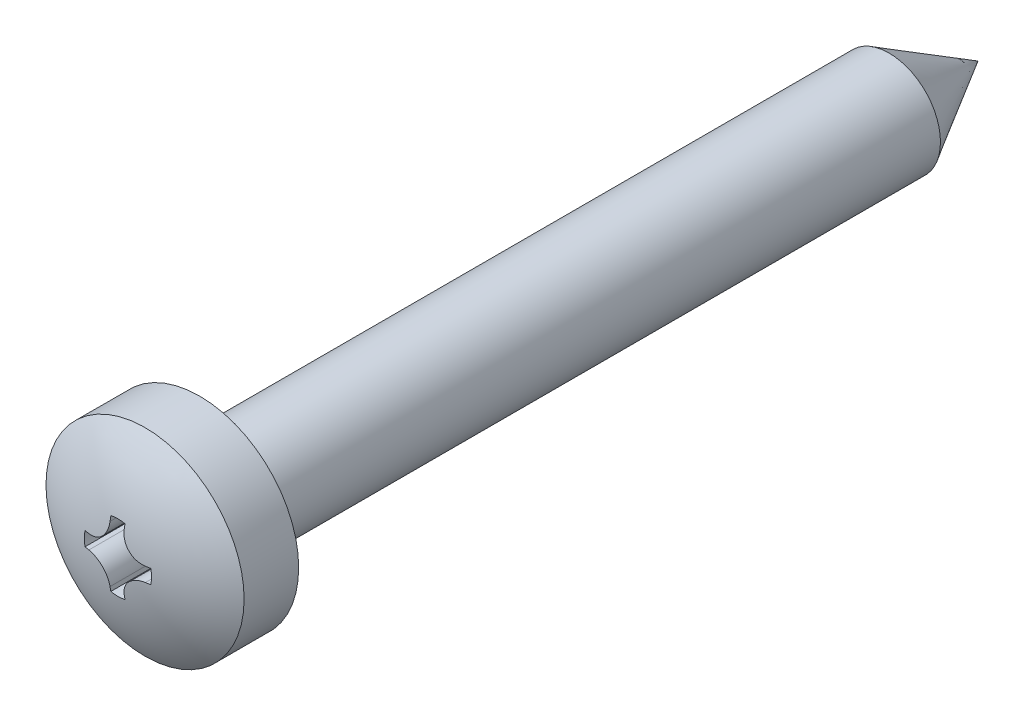
ISO-10303-21;
HEADER;
FILE_DESCRIPTION(('STEP AP214'),'2;1');
FILE_NAME('part.step','',(''),(''),'','','');
FILE_SCHEMA(('AUTOMOTIVE_DESIGN { 1 0 10303 214 1 1 1 1 }'));
ENDSEC;
DATA;
#1=APPLICATION_CONTEXT('core data for automotive mechanical design processes');
#2=APPLICATION_PROTOCOL_DEFINITION('international standard','automotive_design',2000,#1);
#3=PRODUCT_CONTEXT('',#1,'mechanical');
#4=PRODUCT('Part','Part','',(#3));
#5=PRODUCT_RELATED_PRODUCT_CATEGORY('part','',(#4));
#6=PRODUCT_DEFINITION_FORMATION('','',#4);
#7=PRODUCT_DEFINITION_CONTEXT('part definition',#1,'design');
#8=PRODUCT_DEFINITION('design','',#6,#7);
#9=PRODUCT_DEFINITION_SHAPE('','',#8);
#10=(LENGTH_UNIT() NAMED_UNIT(*) SI_UNIT(.MILLI.,.METRE.));
#11=(NAMED_UNIT(*) PLANE_ANGLE_UNIT() SI_UNIT($,.RADIAN.));
#12=(NAMED_UNIT(*) SI_UNIT($,.STERADIAN.) SOLID_ANGLE_UNIT());
#13=UNCERTAINTY_MEASURE_WITH_UNIT(LENGTH_MEASURE(1.E-05),#10,'distance_accuracy_value','');
#14=(GEOMETRIC_REPRESENTATION_CONTEXT(3) GLOBAL_UNCERTAINTY_ASSIGNED_CONTEXT((#13)) GLOBAL_UNIT_ASSIGNED_CONTEXT((#10,
#11,#12)) REPRESENTATION_CONTEXT('',''));
#15=CARTESIAN_POINT('',(0.,0.,0.));
#16=DIRECTION('',(0.,0.,1.));
#17=DIRECTION('',(1.,0.,0.));
#18=AXIS2_PLACEMENT_3D('',#15,#16,#17);
#19=CARTESIAN_POINT('',(0.,0.,19.4));
#20=DIRECTION('',(0.,0.,1.));
#21=DIRECTION('',(0.,1.,0.));
#22=AXIS2_PLACEMENT_3D('',#19,#20,#21);
#23=SPHERICAL_SURFACE('',#22,5.);
#24=CARTESIAN_POINT('',(0.,0.,23.5424630354416));
#25=DIRECTION('',(0.,0.,1.));
#26=DIRECTION('',(1.,0.,0.));
#27=AXIS2_PLACEMENT_3D('',#24,#25,#26);
#28=CIRCLE('',#27,2.8);
#29=CARTESIAN_POINT('',(2.8,0.,23.5424630354416));
#30=VERTEX_POINT('',#29);
#31=EDGE_CURVE('E189',#30,#30,#28,.T.);
#32=ORIENTED_EDGE('',*,*,#31,.T.);
#33=EDGE_LOOP('',(#32));
#34=FACE_BOUND('',#33,.T.);
#35=CARTESIAN_POINT('',(0.,0.,24.3089204515861));
#36=DIRECTION('',(0.,0.,-1.));
#37=DIRECTION('',(-1.,0.,0.));
#38=AXIS2_PLACEMENT_3D('',#35,#36,#37);
#39=CIRCLE('',#38,0.95);
#40=CARTESIAN_POINT('',(0.199999999999999,0.928708781050336,24.3089204515861));
#41=VERTEX_POINT('',#40);
#42=CARTESIAN_POINT('',(-0.199999999999997,0.928708781050336,24.3089204515861));
#43=VERTEX_POINT('',#42);
#44=EDGE_CURVE('E293',#41,#43,#39,.F.);
#45=ORIENTED_EDGE('',*,*,#44,.F.);
#46=CARTESIAN_POINT('',(0.200000000000013,0.,19.4));
#47=DIRECTION('',(-1.,0.,0.));
#48=DIRECTION('',(0.,-1.,0.));
#49=AXIS2_PLACEMENT_3D('',#46,#47,#48);
#50=CIRCLE('',#49,4.99599839871872);
#51=CARTESIAN_POINT('',(0.200000000000001,0.797500009462237,24.3319361040982));
#52=VERTEX_POINT('',#51);
#53=EDGE_CURVE('E175',#52,#41,#50,.T.);
#54=ORIENTED_EDGE('',*,*,#53,.F.);
#55=CARTESIAN_POINT('',(0.200000033472805,0.797700009462236,24.3319037583386));
#56=CARTESIAN_POINT('',(0.199959253117828,0.764708817685606,24.3372450026347));
#57=CARTESIAN_POINT('',(0.202709128813232,0.731640466129004,24.3421389681577));
#58=CARTESIAN_POINT('',(0.213653637195818,0.666282732986848,24.3509117634436));
#59=CARTESIAN_POINT('',(0.221847801353419,0.633993284617508,24.3547906805205));
#60=CARTESIAN_POINT('',(0.243555568778322,0.571088201610531,24.3614171793675));
#61=CARTESIAN_POINT('',(0.257074653927373,0.540474329048727,24.364163589265));
#62=CARTESIAN_POINT('',(0.289068737352572,0.481878485435129,24.3684353734394));
#63=CARTESIAN_POINT('',(0.30754153494713,0.453895353117194,24.3699612887238));
#64=CARTESIAN_POINT('',(0.348646595686665,0.401741777280698,24.371733860277));
#65=CARTESIAN_POINT('',(0.371219136327946,0.377524829205055,24.3719975623989));
#66=CARTESIAN_POINT('',(0.42004221247523,0.33315104363588,24.3712838517845));
#67=CARTESIAN_POINT('',(0.446293163672993,0.31299466564983,24.3703062986749));
#68=CARTESIAN_POINT('',(0.501529122246131,0.277422821121843,24.3671501235125));
#69=CARTESIAN_POINT('',(0.530496065410743,0.261978583187333,24.3649790268822));
#70=CARTESIAN_POINT('',(0.590474078177402,0.236061672214504,24.3595049326867));
#71=CARTESIAN_POINT('',(0.621484749229964,0.225588033102557,24.3562021552872));
#72=CARTESIAN_POINT('',(0.67678218077813,0.211811110107704,24.349515949383));
#73=CARTESIAN_POINT('',(0.700820773823943,0.207371844731834,24.3463573247891));
#74=CARTESIAN_POINT('',(0.749150929493058,0.201461310152338,24.3395132745871));
#75=CARTESIAN_POINT('',(0.773442081704409,0.199985810303452,24.3358286079455));
#76=CARTESIAN_POINT('',(0.797700009462237,0.200000033472804,24.3319037583386));
#77=B_SPLINE_CURVE_WITH_KNOTS('',3,(#55,#56,#57,#58,#59,#60,#61,#62,#63,#64,#65,#66,#67,#68,#69,
#70,#71,#72,#73,#74,#75,#76),.UNSPECIFIED.,.F.,.F.,(4,2,2,2,2,2,2,2,2,2,4),(0.,
0.100151318053274,0.200294018308518,0.30054008372607,0.400741688499828,0.499586204595047,
0.598441899985654,0.696681331546745,0.794901661700852,0.86866818761134,0.94232933999777),.UNSPECIFIED.);
#78=CARTESIAN_POINT('',(0.797500009462238,0.2,24.3319361040982));
#79=VERTEX_POINT('',#78);
#80=EDGE_CURVE('E284',#52,#79,#77,.T.);
#81=ORIENTED_EDGE('',*,*,#80,.T.);
#82=CARTESIAN_POINT('',(0.,0.200000000000013,19.4));
#83=DIRECTION('',(0.,1.,0.));
#84=DIRECTION('',(-1.,0.,0.));
#85=AXIS2_PLACEMENT_3D('',#82,#83,#84);
#86=CIRCLE('',#85,4.99599839871872);
#87=CARTESIAN_POINT('',(0.928708781050337,0.199999999999998,24.3089204515861));
#88=VERTEX_POINT('',#87);
#89=EDGE_CURVE('E291',#79,#88,#86,.T.);
#90=ORIENTED_EDGE('',*,*,#89,.T.);
#91=CARTESIAN_POINT('',(0.,0.,24.3089204515861));
#92=DIRECTION('',(0.,0.,-1.));
#93=DIRECTION('',(-1.,0.,0.));
#94=AXIS2_PLACEMENT_3D('',#91,#92,#93);
#95=CIRCLE('',#94,0.950000000000001);
#96=CARTESIAN_POINT('',(0.928708781050337,-0.199999999999996,24.3089204515861));
#97=VERTEX_POINT('',#96);
#98=EDGE_CURVE('E366',#88,#97,#95,.T.);
#99=ORIENTED_EDGE('',*,*,#98,.T.);
#100=CARTESIAN_POINT('',(0.,-0.200000000000022,19.4));
#101=DIRECTION('',(0.,1.,0.));
#102=DIRECTION('',(-1.,0.,0.));
#103=AXIS2_PLACEMENT_3D('',#100,#101,#102);
#104=CIRCLE('',#103,4.99599839871872);
#105=CARTESIAN_POINT('',(0.797500009462238,-0.2,24.3319361040982));
#106=VERTEX_POINT('',#105);
#107=EDGE_CURVE('E256',#106,#97,#104,.T.);
#108=ORIENTED_EDGE('',*,*,#107,.F.);
#109=CARTESIAN_POINT('',(0.200000033472805,-0.797700009462236,24.3319037583386));
#110=CARTESIAN_POINT('',(0.199959253117828,-0.764708817685606,24.3372450026347));
#111=CARTESIAN_POINT('',(0.202709128813232,-0.731640466129004,24.3421389681577));
#112=CARTESIAN_POINT('',(0.213653637195818,-0.666282732986848,24.3509117634436));
#113=CARTESIAN_POINT('',(0.221847801353418,-0.633993284617508,24.3547906805205));
#114=CARTESIAN_POINT('',(0.243555568778322,-0.571088201610532,24.3614171793675));
#115=CARTESIAN_POINT('',(0.257074653927373,-0.540474329048727,24.364163589265));
#116=CARTESIAN_POINT('',(0.289068737352572,-0.48187848543513,24.3684353734394));
#117=CARTESIAN_POINT('',(0.307541534947129,-0.453895353117195,24.3699612887238));
#118=CARTESIAN_POINT('',(0.348646595686665,-0.401741777280698,24.371733860277));
#119=CARTESIAN_POINT('',(0.371219136327946,-0.377524829205055,24.3719975623989));
#120=CARTESIAN_POINT('',(0.42004221247523,-0.33315104363588,24.3712838517845));
#121=CARTESIAN_POINT('',(0.446293163672993,-0.312994665649831,24.3703062986749));
#122=CARTESIAN_POINT('',(0.501529122246131,-0.277422821121843,24.3671501235125));
#123=CARTESIAN_POINT('',(0.530496065410742,-0.261978583187333,24.3649790268822));
#124=CARTESIAN_POINT('',(0.590474078177402,-0.236061672214504,24.3595049326867));
#125=CARTESIAN_POINT('',(0.621484749229964,-0.225588033102557,24.3562021552872));
#126=CARTESIAN_POINT('',(0.67678218077813,-0.211811110107704,24.349515949383));
#127=CARTESIAN_POINT('',(0.700820773823943,-0.207371844731834,24.3463573247891));
#128=CARTESIAN_POINT('',(0.749150929493058,-0.201461310152338,24.3395132745871));
#129=CARTESIAN_POINT('',(0.773442081704408,-0.199985810303452,24.3358286079455));
#130=CARTESIAN_POINT('',(0.797700009462237,-0.200000033472804,24.3319037583386));
#131=B_SPLINE_CURVE_WITH_KNOTS('',3,(#109,#110,#111,#112,#113,#114,#115,#116,#117,#118,#119,
#120,#121,#122,#123,#124,#125,#126,#127,#128,#129,#130),.UNSPECIFIED.,.F.,.F.,(4,2,2,2,2,2,2,2,
2,2,4),(0.,0.100151318053274,0.200294018308518,0.300540083726069,0.400741688499827,
0.499586204595047,0.598441899985654,0.696681331546744,0.794901661700852,0.86866818761134,
0.94232933999777),.UNSPECIFIED.);
#132=CARTESIAN_POINT('',(0.200000000000001,-0.797500009462237,24.3319361040982));
#133=VERTEX_POINT('',#132);
#134=EDGE_CURVE('E250',#133,#106,#131,.T.);
#135=ORIENTED_EDGE('',*,*,#134,.F.);
#136=CARTESIAN_POINT('',(0.20000000000001,0.,19.4));
#137=DIRECTION('',(1.,0.,0.));
#138=DIRECTION('',(0.,1.,0.));
#139=AXIS2_PLACEMENT_3D('',#136,#137,#138);
#140=CIRCLE('',#139,4.99599839871872);
#141=CARTESIAN_POINT('',(0.199999999999999,-0.928708781050336,24.3089204515861));
#142=VERTEX_POINT('',#141);
#143=EDGE_CURVE('E247',#133,#142,#140,.T.);
#144=ORIENTED_EDGE('',*,*,#143,.T.);
#145=CARTESIAN_POINT('',(0.,0.,24.3089204515861));
#146=DIRECTION('',(0.,0.,-1.));
#147=DIRECTION('',(-1.,0.,0.));
#148=AXIS2_PLACEMENT_3D('',#145,#146,#147);
#149=CIRCLE('',#148,0.95);
#150=CARTESIAN_POINT('',(-0.199999999999997,-0.928708781050336,24.3089204515861));
#151=VERTEX_POINT('',#150);
#152=EDGE_CURVE('E244',#142,#151,#149,.T.);
#153=ORIENTED_EDGE('',*,*,#152,.T.);
#154=CARTESIAN_POINT('',(-0.200000000000015,0.,19.4));
#155=DIRECTION('',(1.,0.,0.));
#156=DIRECTION('',(0.,1.,0.));
#157=AXIS2_PLACEMENT_3D('',#154,#155,#156);
#158=CIRCLE('',#157,4.99599839871872);
#159=CARTESIAN_POINT('',(-0.2,-0.797500009462236,24.3319361040982));
#160=VERTEX_POINT('',#159);
#161=EDGE_CURVE('E241',#160,#151,#158,.T.);
#162=ORIENTED_EDGE('',*,*,#161,.F.);
#163=CARTESIAN_POINT('',(-0.200000033472803,-0.797700009462235,24.3319037583386));
#164=CARTESIAN_POINT('',(-0.199959253117827,-0.764708817685605,24.3372450026347));
#165=CARTESIAN_POINT('',(-0.20270912881323,-0.731640466129003,24.3421389681577));
#166=CARTESIAN_POINT('',(-0.213653637195817,-0.666282732986848,24.3509117634436));
#167=CARTESIAN_POINT('',(-0.221847801353417,-0.633993284617507,24.3547906805205));
#168=CARTESIAN_POINT('',(-0.24355556877832,-0.57108820161053,24.3614171793675));
#169=CARTESIAN_POINT('',(-0.257074653927372,-0.540474329048726,24.364163589265));
#170=CARTESIAN_POINT('',(-0.28906873735257,-0.481878485435128,24.3684353734394));
#171=CARTESIAN_POINT('',(-0.307541534947128,-0.453895353117193,24.3699612887238));
#172=CARTESIAN_POINT('',(-0.348646595686664,-0.401741777280697,24.371733860277));
#173=CARTESIAN_POINT('',(-0.371219136327945,-0.377524829205054,24.3719975623989));
#174=CARTESIAN_POINT('',(-0.420042212475229,-0.333151043635879,24.3712838517845));
#175=CARTESIAN_POINT('',(-0.446293163672991,-0.31299466564983,24.3703062986749));
#176=CARTESIAN_POINT('',(-0.501529122246129,-0.277422821121843,24.3671501235125));
#177=CARTESIAN_POINT('',(-0.530496065410741,-0.261978583187332,24.3649790268822));
#178=CARTESIAN_POINT('',(-0.5904740781774,-0.236061672214503,24.3595049326867));
#179=CARTESIAN_POINT('',(-0.621484749229962,-0.225588033102557,24.3562021552872));
#180=CARTESIAN_POINT('',(-0.676782180778129,-0.211811110107704,24.349515949383));
#181=CARTESIAN_POINT('',(-0.700820773823942,-0.207371844731833,24.3463573247891));
#182=CARTESIAN_POINT('',(-0.749150929493057,-0.201461310152337,24.3395132745871));
#183=CARTESIAN_POINT('',(-0.773442081704407,-0.199985810303451,24.3358286079455));
#184=CARTESIAN_POINT('',(-0.797700009462235,-0.200000033472803,24.3319037583386));
#185=B_SPLINE_CURVE_WITH_KNOTS('',3,(#163,#164,#165,#166,#167,#168,#169,#170,#171,#172,#173,
#174,#175,#176,#177,#178,#179,#180,#181,#182,#183,#184),.UNSPECIFIED.,.F.,.F.,(4,2,2,2,2,2,2,2,
2,2,4),(0.,0.100151318053273,0.200294018308518,0.30054008372607,0.400741688499828,
0.499586204595047,0.598441899985654,0.696681331546744,0.794901661700851,0.86866818761134,
0.942329339997769),.UNSPECIFIED.);
#186=CARTESIAN_POINT('',(-0.797500009462236,-0.199999999999999,24.3319361040982));
#187=VERTEX_POINT('',#186);
#188=EDGE_CURVE('E234',#160,#187,#185,.T.);
#189=ORIENTED_EDGE('',*,*,#188,.T.);
#190=CARTESIAN_POINT('',(0.,-0.200000000000015,19.4));
#191=DIRECTION('',(0.,-1.,0.));
#192=DIRECTION('',(1.,0.,0.));
#193=AXIS2_PLACEMENT_3D('',#190,#191,#192);
#194=CIRCLE('',#193,4.99599839871872);
#195=CARTESIAN_POINT('',(-0.928708781050336,-0.199999999999997,24.3089204515861));
#196=VERTEX_POINT('',#195);
#197=EDGE_CURVE('E242',#187,#196,#194,.T.);
#198=ORIENTED_EDGE('',*,*,#197,.T.);
#199=CARTESIAN_POINT('',(0.,0.,24.3089204515861));
#200=DIRECTION('',(0.,0.,-1.));
#201=DIRECTION('',(-1.,0.,0.));
#202=AXIS2_PLACEMENT_3D('',#199,#200,#201);
#203=CIRCLE('',#202,0.95);
#204=CARTESIAN_POINT('',(-0.928708781050336,0.199999999999997,24.3089204515861));
#205=VERTEX_POINT('',#204);
#206=EDGE_CURVE('E405',#205,#196,#203,.F.);
#207=ORIENTED_EDGE('',*,*,#206,.F.);
#208=CARTESIAN_POINT('',(0.,0.200000000000015,19.4));
#209=DIRECTION('',(0.,-1.,0.));
#210=DIRECTION('',(1.,0.,0.));
#211=AXIS2_PLACEMENT_3D('',#208,#209,#210);
#212=CIRCLE('',#211,4.99599839871872);
#213=CARTESIAN_POINT('',(-0.797500009462236,0.199999999999999,24.3319361040982));
#214=VERTEX_POINT('',#213);
#215=EDGE_CURVE('E202',#214,#205,#212,.T.);
#216=ORIENTED_EDGE('',*,*,#215,.F.);
#217=CARTESIAN_POINT('',(-0.200000033472804,0.797700009462235,24.3319037583386));
#218=CARTESIAN_POINT('',(-0.199959253117827,0.764708817685605,24.3372450026347));
#219=CARTESIAN_POINT('',(-0.20270912881323,0.731640466129002,24.3421389681577));
#220=CARTESIAN_POINT('',(-0.213653637195817,0.666282732986847,24.3509117634436));
#221=CARTESIAN_POINT('',(-0.221847801353417,0.633993284617507,24.3547906805205));
#222=CARTESIAN_POINT('',(-0.24355556877832,0.57108820161053,24.3614171793675));
#223=CARTESIAN_POINT('',(-0.257074653927372,0.540474329048726,24.364163589265));
#224=CARTESIAN_POINT('',(-0.28906873735257,0.481878485435129,24.3684353734394));
#225=CARTESIAN_POINT('',(-0.307541534947128,0.453895353117193,24.3699612887238));
#226=CARTESIAN_POINT('',(-0.348646595686664,0.401741777280697,24.371733860277));
#227=CARTESIAN_POINT('',(-0.371219136327945,0.377524829205054,24.3719975623989));
#228=CARTESIAN_POINT('',(-0.420042212475229,0.333151043635879,24.3712838517845));
#229=CARTESIAN_POINT('',(-0.446293163672992,0.31299466564983,24.3703062986749));
#230=CARTESIAN_POINT('',(-0.501529122246129,0.277422821121842,24.3671501235125));
#231=CARTESIAN_POINT('',(-0.530496065410741,0.261978583187332,24.3649790268822));
#232=CARTESIAN_POINT('',(-0.590474078177401,0.236061672214503,24.3595049326867));
#233=CARTESIAN_POINT('',(-0.621484749229963,0.225588033102556,24.3562021552872));
#234=CARTESIAN_POINT('',(-0.676782180778129,0.211811110107703,24.349515949383));
#235=CARTESIAN_POINT('',(-0.700820773823943,0.207371844731833,24.3463573247891));
#236=CARTESIAN_POINT('',(-0.749150929493057,0.201461310152337,24.3395132745871));
#237=CARTESIAN_POINT('',(-0.773442081704407,0.199985810303451,24.3358286079455));
#238=CARTESIAN_POINT('',(-0.797700009462235,0.200000033472803,24.3319037583386));
#239=B_SPLINE_CURVE_WITH_KNOTS('',3,(#217,#218,#219,#220,#221,#222,#223,#224,#225,#226,#227,
#228,#229,#230,#231,#232,#233,#234,#235,#236,#237,#238),.UNSPECIFIED.,.F.,.F.,(4,2,2,2,2,2,2,2,
2,2,4),(0.,0.100151318053274,0.200294018308518,0.30054008372607,0.400741688499827,
0.499586204595047,0.598441899985654,0.696681331546744,0.794901661700852,0.868668187611341,
0.942329339997769),.UNSPECIFIED.);
#240=CARTESIAN_POINT('',(-0.2,0.797500009462236,24.3319361040982));
#241=VERTEX_POINT('',#240);
#242=EDGE_CURVE('E195',#241,#214,#239,.T.);
#243=ORIENTED_EDGE('',*,*,#242,.F.);
#244=CARTESIAN_POINT('',(-0.200000000000015,0.,19.4));
#245=DIRECTION('',(-1.,0.,0.));
#246=DIRECTION('',(0.,-1.,0.));
#247=AXIS2_PLACEMENT_3D('',#244,#245,#246);
#248=CIRCLE('',#247,4.99599839871872);
#249=EDGE_CURVE('E192',#241,#43,#248,.T.);
#250=ORIENTED_EDGE('',*,*,#249,.T.);
#251=EDGE_LOOP('',(#45,#54,#81,#90,#99,#108,#135,#144,#153,#162,#189,#198,#207,#216,#243,#250));
#252=FACE_BOUND('',#251,.T.);
#253=ADVANCED_FACE('F40',(#34,#252),#23,.T.);
#254=CARTESIAN_POINT('',(0.,0.,0.));
#255=DIRECTION('',(0.,0.,1.));
#256=DIRECTION('',(1.,0.,0.));
#257=AXIS2_PLACEMENT_3D('',#254,#255,#256);
#258=CONICAL_SURFACE('',#257,0.,0.523598775598292);
#259=CARTESIAN_POINT('',(0.,0.,2.51147367097491));
#260=DIRECTION('',(0.,0.,1.));
#261=DIRECTION('',(1.,0.,0.));
#262=AXIS2_PLACEMENT_3D('',#259,#260,#261);
#263=CIRCLE('',#262,1.45);
#264=CARTESIAN_POINT('',(1.45,0.,2.51147367097491));
#265=VERTEX_POINT('',#264);
#266=EDGE_CURVE('E176',#265,#265,#263,.T.);
#267=ORIENTED_EDGE('',*,*,#266,.F.);
#268=EDGE_LOOP('',(#267));
#269=FACE_BOUND('',#268,.T.);
#270=CARTESIAN_POINT('',(0.,0.,0.));
#271=VERTEX_POINT('',#270);
#272=VERTEX_LOOP('',#271);
#273=FACE_BOUND('',#272,.T.);
#274=ADVANCED_FACE('F307',(#269,#273),#258,.T.);
#275=CARTESIAN_POINT('',(0.,0.,11.71));
#276=DIRECTION('',(0.,0.,1.));
#277=DIRECTION('',(1.,0.,0.));
#278=AXIS2_PLACEMENT_3D('',#275,#276,#277);
#279=CYLINDRICAL_SURFACE('',#278,2.8);
#280=ORIENTED_EDGE('',*,*,#31,.F.);
#281=EDGE_LOOP('',(#280));
#282=FACE_BOUND('',#281,.T.);
#283=CARTESIAN_POINT('',(0.,0.,22.));
#284=DIRECTION('',(0.,0.,1.));
#285=DIRECTION('',(1.,0.,0.));
#286=AXIS2_PLACEMENT_3D('',#283,#284,#285);
#287=CIRCLE('',#286,2.8);
#288=CARTESIAN_POINT('',(2.8,0.,22.));
#289=VERTEX_POINT('',#288);
#290=EDGE_CURVE('E180',#289,#289,#287,.T.);
#291=ORIENTED_EDGE('',*,*,#290,.T.);
#292=EDGE_LOOP('',(#291));
#293=FACE_BOUND('',#292,.T.);
#294=ADVANCED_FACE('F312',(#282,#293),#279,.T.);
#295=CARTESIAN_POINT('',(0.,2.8,22.));
#296=DIRECTION('',(0.,0.,1.));
#297=DIRECTION('',(1.,0.,0.));
#298=AXIS2_PLACEMENT_3D('',#295,#296,#297);
#299=PLANE('',#298);
#300=CARTESIAN_POINT('',(0.,0.,22.));
#301=DIRECTION('',(0.,0.,1.));
#302=DIRECTION('',(1.,0.,0.));
#303=AXIS2_PLACEMENT_3D('',#300,#301,#302);
#304=CIRCLE('',#303,1.55);
#305=CARTESIAN_POINT('',(1.55,0.,22.));
#306=VERTEX_POINT('',#305);
#307=EDGE_CURVE('E49',#306,#306,#304,.T.);
#308=ORIENTED_EDGE('',*,*,#307,.T.);
#309=EDGE_LOOP('',(#308));
#310=FACE_BOUND('',#309,.T.);
#311=ORIENTED_EDGE('',*,*,#290,.F.);
#312=EDGE_LOOP('',(#311));
#313=FACE_BOUND('',#312,.T.);
#314=ADVANCED_FACE('F297',(#310,#313),#299,.F.);
#315=CARTESIAN_POINT('',(0.,0.,11.71));
#316=DIRECTION('',(0.,0.,1.));
#317=DIRECTION('',(1.,0.,0.));
#318=AXIS2_PLACEMENT_3D('',#315,#316,#317);
#319=CYLINDRICAL_SURFACE('',#318,1.45);
#320=CARTESIAN_POINT('',(0.,0.,21.9));
#321=DIRECTION('',(0.,0.,1.));
#322=DIRECTION('',(1.,0.,0.));
#323=AXIS2_PLACEMENT_3D('',#320,#321,#322);
#324=CIRCLE('',#323,1.45);
#325=CARTESIAN_POINT('',(1.45,0.,21.9));
#326=VERTEX_POINT('',#325);
#327=EDGE_CURVE('E11',#326,#326,#324,.F.);
#328=ORIENTED_EDGE('',*,*,#327,.T.);
#329=EDGE_LOOP('',(#328));
#330=FACE_BOUND('',#329,.T.);
#331=ORIENTED_EDGE('',*,*,#266,.T.);
#332=EDGE_LOOP('',(#331));
#333=FACE_BOUND('',#332,.T.);
#334=ADVANCED_FACE('F459',(#330,#333),#319,.T.);
#335=CARTESIAN_POINT('',(0.,0.,23.2));
#336=DIRECTION('',(0.,0.,1.));
#337=DIRECTION('',(1.,0.,0.));
#338=AXIS2_PLACEMENT_3D('',#335,#336,#337);
#339=CYLINDRICAL_SURFACE('',#338,0.95);
#340=ORIENTED_EDGE('',*,*,#44,.T.);
#341=DIRECTION('',(0.,0.,1.));
#342=VECTOR('',#341,1.);
#343=CARTESIAN_POINT('',(-0.199999999999997,0.928708781050336,23.2));
#344=LINE('',#343,#342);
#345=CARTESIAN_POINT('',(-0.199999999999997,0.928708781050336,23.2));
#346=VERTEX_POINT('',#345);
#347=EDGE_CURVE('E56',#346,#43,#344,.T.);
#348=ORIENTED_EDGE('',*,*,#347,.F.);
#349=CARTESIAN_POINT('',(0.,0.,23.2));
#350=DIRECTION('',(0.,0.,-1.));
#351=DIRECTION('',(-1.,0.,0.));
#352=AXIS2_PLACEMENT_3D('',#349,#350,#351);
#353=CIRCLE('',#352,0.95);
#354=CARTESIAN_POINT('',(0.199999999999999,0.928708781050336,23.2));
#355=VERTEX_POINT('',#354);
#356=EDGE_CURVE('E158',#346,#355,#353,.T.);
#357=ORIENTED_EDGE('',*,*,#356,.T.);
#358=DIRECTION('',(0.,0.,1.));
#359=VECTOR('',#358,1.);
#360=CARTESIAN_POINT('',(0.199999999999999,0.928708781050336,23.2));
#361=LINE('',#360,#359);
#362=EDGE_CURVE('E170',#355,#41,#361,.T.);
#363=ORIENTED_EDGE('',*,*,#362,.T.);
#364=EDGE_LOOP('',(#340,#348,#357,#363));
#365=FACE_BOUND('',#364,.T.);
#366=ADVANCED_FACE('F169',(#365),#339,.F.);
#367=CARTESIAN_POINT('',(0.199999999999999,0.928708781050336,23.2));
#368=DIRECTION('',(-1.,0.,0.));
#369=DIRECTION('',(0.,-1.,0.));
#370=AXIS2_PLACEMENT_3D('',#367,#368,#369);
#371=PLANE('',#370);
#372=ORIENTED_EDGE('',*,*,#53,.T.);
#373=ORIENTED_EDGE('',*,*,#362,.F.);
#374=DIRECTION('',(0.,-1.,0.));
#375=VECTOR('',#374,1.);
#376=CARTESIAN_POINT('',(0.199999999999999,0.928708781050336,23.2));
#377=LINE('',#376,#375);
#378=CARTESIAN_POINT('',(0.200000000000001,0.797500009462237,23.2));
#379=VERTEX_POINT('',#378);
#380=EDGE_CURVE('E154',#355,#379,#377,.T.);
#381=ORIENTED_EDGE('',*,*,#380,.T.);
#382=DIRECTION('',(0.,0.,1.));
#383=VECTOR('',#382,1.);
#384=CARTESIAN_POINT('',(0.200000000000001,0.797500009462237,23.2));
#385=LINE('',#384,#383);
#386=EDGE_CURVE('E177',#379,#52,#385,.T.);
#387=ORIENTED_EDGE('',*,*,#386,.T.);
#388=EDGE_LOOP('',(#372,#373,#381,#387));
#389=FACE_BOUND('',#388,.T.);
#390=ADVANCED_FACE('F173',(#389),#371,.T.);
#391=CARTESIAN_POINT('',(0.797500009462238,0.797500009462237,23.2));
#392=DIRECTION('',(0.,0.,1.));
#393=DIRECTION('',(1.,0.,0.));
#394=AXIS2_PLACEMENT_3D('',#391,#392,#393);
#395=CYLINDRICAL_SURFACE('',#394,0.597500009462237);
#396=ORIENTED_EDGE('',*,*,#386,.F.);
#397=CARTESIAN_POINT('',(0.797500009462238,0.797500009462237,23.2));
#398=DIRECTION('',(0.,0.,-1.));
#399=DIRECTION('',(-1.,0.,0.));
#400=AXIS2_PLACEMENT_3D('',#397,#398,#399);
#401=CIRCLE('',#400,0.597500009462237);
#402=CARTESIAN_POINT('',(0.797500009462238,0.2,23.2));
#403=VERTEX_POINT('',#402);
#404=EDGE_CURVE('E161',#403,#379,#401,.T.);
#405=ORIENTED_EDGE('',*,*,#404,.F.);
#406=DIRECTION('',(0.,0.,1.));
#407=VECTOR('',#406,1.);
#408=CARTESIAN_POINT('',(0.797500009462238,0.2,23.2));
#409=LINE('',#408,#407);
#410=EDGE_CURVE('E182',#403,#79,#409,.T.);
#411=ORIENTED_EDGE('',*,*,#410,.T.);
#412=ORIENTED_EDGE('',*,*,#80,.F.);
#413=EDGE_LOOP('',(#396,#405,#411,#412));
#414=FACE_BOUND('',#413,.T.);
#415=ADVANCED_FACE('F276',(#414),#395,.T.);
#416=CARTESIAN_POINT('',(0.928708781050337,0.199999999999998,23.2));
#417=DIRECTION('',(0.,1.,0.));
#418=DIRECTION('',(-1.,0.,0.));
#419=AXIS2_PLACEMENT_3D('',#416,#417,#418);
#420=PLANE('',#419);
#421=ORIENTED_EDGE('',*,*,#410,.F.);
#422=DIRECTION('',(-1.,0.,0.));
#423=VECTOR('',#422,1.);
#424=CARTESIAN_POINT('',(0.928708781050337,0.199999999999998,23.2));
#425=LINE('',#424,#423);
#426=CARTESIAN_POINT('',(0.928708781050337,0.199999999999998,23.2));
#427=VERTEX_POINT('',#426);
#428=EDGE_CURVE('E374',#427,#403,#425,.T.);
#429=ORIENTED_EDGE('',*,*,#428,.F.);
#430=DIRECTION('',(0.,0.,1.));
#431=VECTOR('',#430,1.);
#432=CARTESIAN_POINT('',(0.928708781050337,0.199999999999998,23.2));
#433=LINE('',#432,#431);
#434=EDGE_CURVE('E359',#427,#88,#433,.T.);
#435=ORIENTED_EDGE('',*,*,#434,.T.);
#436=ORIENTED_EDGE('',*,*,#89,.F.);
#437=EDGE_LOOP('',(#421,#429,#435,#436));
#438=FACE_BOUND('',#437,.T.);
#439=ADVANCED_FACE('F272',(#438),#420,.F.);
#440=CARTESIAN_POINT('',(0.,0.,23.2));
#441=DIRECTION('',(0.,0.,1.));
#442=DIRECTION('',(1.,0.,0.));
#443=AXIS2_PLACEMENT_3D('',#440,#441,#442);
#444=CYLINDRICAL_SURFACE('',#443,0.950000000000001);
#445=ORIENTED_EDGE('',*,*,#434,.F.);
#446=CARTESIAN_POINT('',(0.,0.,23.2));
#447=DIRECTION('',(0.,0.,1.));
#448=DIRECTION('',(1.,0.,0.));
#449=AXIS2_PLACEMENT_3D('',#446,#447,#448);
#450=CIRCLE('',#449,0.950000000000001);
#451=CARTESIAN_POINT('',(0.928708781050337,-0.199999999999997,23.2));
#452=VERTEX_POINT('',#451);
#453=EDGE_CURVE('E372',#452,#427,#450,.T.);
#454=ORIENTED_EDGE('',*,*,#453,.F.);
#455=DIRECTION('',(0.,0.,1.));
#456=VECTOR('',#455,1.);
#457=CARTESIAN_POINT('',(0.928708781050337,-0.199999999999997,23.2));
#458=LINE('',#457,#456);
#459=EDGE_CURVE('E356',#452,#97,#458,.T.);
#460=ORIENTED_EDGE('',*,*,#459,.T.);
#461=ORIENTED_EDGE('',*,*,#98,.F.);
#462=EDGE_LOOP('',(#445,#454,#460,#461));
#463=FACE_BOUND('',#462,.T.);
#464=ADVANCED_FACE('F268',(#463),#444,.F.);
#465=CARTESIAN_POINT('',(0.928708781050338,-0.199999999999996,23.2));
#466=DIRECTION('',(0.,1.,0.));
#467=DIRECTION('',(-1.,0.,0.));
#468=AXIS2_PLACEMENT_3D('',#465,#466,#467);
#469=PLANE('',#468);
#470=ORIENTED_EDGE('',*,*,#107,.T.);
#471=ORIENTED_EDGE('',*,*,#459,.F.);
#472=DIRECTION('',(-1.,0.,0.));
#473=VECTOR('',#472,1.);
#474=CARTESIAN_POINT('',(0.928708781050338,-0.199999999999996,23.2));
#475=LINE('',#474,#473);
#476=CARTESIAN_POINT('',(0.797500009462238,-0.2,23.2));
#477=VERTEX_POINT('',#476);
#478=EDGE_CURVE('E373',#452,#477,#475,.T.);
#479=ORIENTED_EDGE('',*,*,#478,.T.);
#480=DIRECTION('',(0.,0.,1.));
#481=VECTOR('',#480,1.);
#482=CARTESIAN_POINT('',(0.797500009462238,-0.2,23.2));
#483=LINE('',#482,#481);
#484=EDGE_CURVE('E353',#477,#106,#483,.T.);
#485=ORIENTED_EDGE('',*,*,#484,.T.);
#486=EDGE_LOOP('',(#470,#471,#479,#485));
#487=FACE_BOUND('',#486,.T.);
#488=ADVANCED_FACE('F264',(#487),#469,.T.);
#489=CARTESIAN_POINT('',(0.797500009462238,-0.797500009462237,23.2));
#490=DIRECTION('',(0.,0.,1.));
#491=DIRECTION('',(1.,0.,0.));
#492=AXIS2_PLACEMENT_3D('',#489,#490,#491);
#493=CYLINDRICAL_SURFACE('',#492,0.597500009462237);
#494=ORIENTED_EDGE('',*,*,#134,.T.);
#495=ORIENTED_EDGE('',*,*,#484,.F.);
#496=CARTESIAN_POINT('',(0.797500009462238,-0.797500009462237,23.2));
#497=DIRECTION('',(0.,0.,1.));
#498=DIRECTION('',(1.,0.,0.));
#499=AXIS2_PLACEMENT_3D('',#496,#497,#498);
#500=CIRCLE('',#499,0.597500009462237);
#501=CARTESIAN_POINT('',(0.200000000000001,-0.797500009462237,23.2));
#502=VERTEX_POINT('',#501);
#503=EDGE_CURVE('E376',#477,#502,#500,.T.);
#504=ORIENTED_EDGE('',*,*,#503,.T.);
#505=DIRECTION('',(0.,0.,1.));
#506=VECTOR('',#505,1.);
#507=CARTESIAN_POINT('',(0.200000000000001,-0.797500009462237,23.2));
#508=LINE('',#507,#506);
#509=EDGE_CURVE('E350',#502,#133,#508,.T.);
#510=ORIENTED_EDGE('',*,*,#509,.T.);
#511=EDGE_LOOP('',(#494,#495,#504,#510));
#512=FACE_BOUND('',#511,.T.);
#513=ADVANCED_FACE('F258',(#512),#493,.T.);
#514=CARTESIAN_POINT('',(0.199999999999999,-0.928708781050336,23.2));
#515=DIRECTION('',(1.,0.,0.));
#516=DIRECTION('',(0.,1.,0.));
#517=AXIS2_PLACEMENT_3D('',#514,#515,#516);
#518=PLANE('',#517);
#519=ORIENTED_EDGE('',*,*,#509,.F.);
#520=DIRECTION('',(0.,1.,0.));
#521=VECTOR('',#520,1.);
#522=CARTESIAN_POINT('',(0.199999999999999,-0.928708781050336,23.2));
#523=LINE('',#522,#521);
#524=CARTESIAN_POINT('',(0.199999999999999,-0.928708781050336,23.2));
#525=VERTEX_POINT('',#524);
#526=EDGE_CURVE('E382',#525,#502,#523,.T.);
#527=ORIENTED_EDGE('',*,*,#526,.F.);
#528=DIRECTION('',(0.,0.,1.));
#529=VECTOR('',#528,1.);
#530=CARTESIAN_POINT('',(0.199999999999999,-0.928708781050336,23.2));
#531=LINE('',#530,#529);
#532=EDGE_CURVE('E347',#525,#142,#531,.T.);
#533=ORIENTED_EDGE('',*,*,#532,.T.);
#534=ORIENTED_EDGE('',*,*,#143,.F.);
#535=EDGE_LOOP('',(#519,#527,#533,#534));
#536=FACE_BOUND('',#535,.T.);
#537=ADVANCED_FACE('F263',(#536),#518,.F.);
#538=CARTESIAN_POINT('',(0.,0.,23.2));
#539=DIRECTION('',(0.,0.,1.));
#540=DIRECTION('',(1.,0.,0.));
#541=AXIS2_PLACEMENT_3D('',#538,#539,#540);
#542=CYLINDRICAL_SURFACE('',#541,0.95);
#543=ORIENTED_EDGE('',*,*,#532,.F.);
#544=CARTESIAN_POINT('',(0.,0.,23.2));
#545=DIRECTION('',(0.,0.,1.));
#546=DIRECTION('',(1.,0.,0.));
#547=AXIS2_PLACEMENT_3D('',#544,#545,#546);
#548=CIRCLE('',#547,0.95);
#549=CARTESIAN_POINT('',(-0.199999999999997,-0.928708781050336,23.2));
#550=VERTEX_POINT('',#549);
#551=EDGE_CURVE('E385',#550,#525,#548,.T.);
#552=ORIENTED_EDGE('',*,*,#551,.F.);
#553=DIRECTION('',(0.,0.,1.));
#554=VECTOR('',#553,1.);
#555=CARTESIAN_POINT('',(-0.199999999999997,-0.928708781050336,23.2));
#556=LINE('',#555,#554);
#557=EDGE_CURVE('E344',#550,#151,#556,.T.);
#558=ORIENTED_EDGE('',*,*,#557,.T.);
#559=ORIENTED_EDGE('',*,*,#152,.F.);
#560=EDGE_LOOP('',(#543,#552,#558,#559));
#561=FACE_BOUND('',#560,.T.);
#562=ADVANCED_FACE('F414',(#561),#542,.F.);
#563=CARTESIAN_POINT('',(-0.199999999999997,-0.928708781050336,23.2));
#564=DIRECTION('',(1.,0.,0.));
#565=DIRECTION('',(0.,1.,0.));
#566=AXIS2_PLACEMENT_3D('',#563,#564,#565);
#567=PLANE('',#566);
#568=ORIENTED_EDGE('',*,*,#161,.T.);
#569=ORIENTED_EDGE('',*,*,#557,.F.);
#570=DIRECTION('',(0.,1.,0.));
#571=VECTOR('',#570,1.);
#572=CARTESIAN_POINT('',(-0.199999999999997,-0.928708781050336,23.2));
#573=LINE('',#572,#571);
#574=CARTESIAN_POINT('',(-0.2,-0.797500009462236,23.2));
#575=VERTEX_POINT('',#574);
#576=EDGE_CURVE('E388',#550,#575,#573,.T.);
#577=ORIENTED_EDGE('',*,*,#576,.T.);
#578=DIRECTION('',(0.,0.,1.));
#579=VECTOR('',#578,1.);
#580=CARTESIAN_POINT('',(-0.2,-0.797500009462236,23.2));
#581=LINE('',#580,#579);
#582=EDGE_CURVE('E341',#575,#160,#581,.T.);
#583=ORIENTED_EDGE('',*,*,#582,.T.);
#584=EDGE_LOOP('',(#568,#569,#577,#583));
#585=FACE_BOUND('',#584,.T.);
#586=ADVANCED_FACE('F230',(#585),#567,.T.);
#587=CARTESIAN_POINT('',(-0.797500009462237,-0.797500009462236,23.2));
#588=DIRECTION('',(0.,0.,1.));
#589=DIRECTION('',(1.,0.,0.));
#590=AXIS2_PLACEMENT_3D('',#587,#588,#589);
#591=CYLINDRICAL_SURFACE('',#590,0.597500009462237);
#592=ORIENTED_EDGE('',*,*,#582,.F.);
#593=CARTESIAN_POINT('',(-0.797500009462237,-0.797500009462236,23.2));
#594=DIRECTION('',(0.,0.,-1.));
#595=DIRECTION('',(-1.,0.,0.));
#596=AXIS2_PLACEMENT_3D('',#593,#594,#595);
#597=CIRCLE('',#596,0.597500009462237);
#598=CARTESIAN_POINT('',(-0.797500009462236,-0.199999999999999,23.2));
#599=VERTEX_POINT('',#598);
#600=EDGE_CURVE('E390',#599,#575,#597,.T.);
#601=ORIENTED_EDGE('',*,*,#600,.F.);
#602=DIRECTION('',(0.,0.,1.));
#603=VECTOR('',#602,1.);
#604=CARTESIAN_POINT('',(-0.797500009462236,-0.199999999999999,23.2));
#605=LINE('',#604,#603);
#606=EDGE_CURVE('E338',#599,#187,#605,.T.);
#607=ORIENTED_EDGE('',*,*,#606,.T.);
#608=ORIENTED_EDGE('',*,*,#188,.F.);
#609=EDGE_LOOP('',(#592,#601,#607,#608));
#610=FACE_BOUND('',#609,.T.);
#611=ADVANCED_FACE('F225',(#610),#591,.T.);
#612=CARTESIAN_POINT('',(-0.928708781050336,-0.199999999999997,23.2));
#613=DIRECTION('',(0.,-1.,0.));
#614=DIRECTION('',(1.,0.,0.));
#615=AXIS2_PLACEMENT_3D('',#612,#613,#614);
#616=PLANE('',#615);
#617=ORIENTED_EDGE('',*,*,#606,.F.);
#618=DIRECTION('',(1.,0.,0.));
#619=VECTOR('',#618,1.);
#620=CARTESIAN_POINT('',(-0.928708781050336,-0.199999999999997,23.2));
#621=LINE('',#620,#619);
#622=CARTESIAN_POINT('',(-0.928708781050336,-0.199999999999997,23.2));
#623=VERTEX_POINT('',#622);
#624=EDGE_CURVE('E393',#623,#599,#621,.T.);
#625=ORIENTED_EDGE('',*,*,#624,.F.);
#626=DIRECTION('',(0.,0.,1.));
#627=VECTOR('',#626,1.);
#628=CARTESIAN_POINT('',(-0.928708781050336,-0.199999999999997,23.2));
#629=LINE('',#628,#627);
#630=EDGE_CURVE('E335',#623,#196,#629,.T.);
#631=ORIENTED_EDGE('',*,*,#630,.T.);
#632=ORIENTED_EDGE('',*,*,#197,.F.);
#633=EDGE_LOOP('',(#617,#625,#631,#632));
#634=FACE_BOUND('',#633,.T.);
#635=ADVANCED_FACE('F221',(#634),#616,.F.);
#636=CARTESIAN_POINT('',(0.,0.,23.2));
#637=DIRECTION('',(0.,0.,1.));
#638=DIRECTION('',(1.,0.,0.));
#639=AXIS2_PLACEMENT_3D('',#636,#637,#638);
#640=CYLINDRICAL_SURFACE('',#639,0.95);
#641=ORIENTED_EDGE('',*,*,#206,.T.);
#642=ORIENTED_EDGE('',*,*,#630,.F.);
#643=CARTESIAN_POINT('',(0.,0.,23.2));
#644=DIRECTION('',(0.,0.,-1.));
#645=DIRECTION('',(-1.,0.,0.));
#646=AXIS2_PLACEMENT_3D('',#643,#644,#645);
#647=CIRCLE('',#646,0.95);
#648=CARTESIAN_POINT('',(-0.928708781050336,0.199999999999996,23.2));
#649=VERTEX_POINT('',#648);
#650=EDGE_CURVE('E396',#623,#649,#647,.T.);
#651=ORIENTED_EDGE('',*,*,#650,.T.);
#652=DIRECTION('',(0.,0.,1.));
#653=VECTOR('',#652,1.);
#654=CARTESIAN_POINT('',(-0.928708781050336,0.199999999999996,23.2));
#655=LINE('',#654,#653);
#656=EDGE_CURVE('E327',#649,#205,#655,.T.);
#657=ORIENTED_EDGE('',*,*,#656,.T.);
#658=EDGE_LOOP('',(#641,#642,#651,#657));
#659=FACE_BOUND('',#658,.T.);
#660=ADVANCED_FACE('F217',(#659),#640,.F.);
#661=CARTESIAN_POINT('',(-0.928708781050336,0.199999999999997,23.2));
#662=DIRECTION('',(0.,-1.,0.));
#663=DIRECTION('',(1.,0.,0.));
#664=AXIS2_PLACEMENT_3D('',#661,#662,#663);
#665=PLANE('',#664);
#666=ORIENTED_EDGE('',*,*,#215,.T.);
#667=ORIENTED_EDGE('',*,*,#656,.F.);
#668=DIRECTION('',(1.,0.,0.));
#669=VECTOR('',#668,1.);
#670=CARTESIAN_POINT('',(-0.928708781050336,0.199999999999997,23.2));
#671=LINE('',#670,#669);
#672=CARTESIAN_POINT('',(-0.797500009462236,0.199999999999999,23.2));
#673=VERTEX_POINT('',#672);
#674=EDGE_CURVE('E398',#649,#673,#671,.T.);
#675=ORIENTED_EDGE('',*,*,#674,.T.);
#676=DIRECTION('',(0.,0.,1.));
#677=VECTOR('',#676,1.);
#678=CARTESIAN_POINT('',(-0.797500009462236,0.199999999999999,23.2));
#679=LINE('',#678,#677);
#680=EDGE_CURVE('E325',#673,#214,#679,.T.);
#681=ORIENTED_EDGE('',*,*,#680,.T.);
#682=EDGE_LOOP('',(#666,#667,#675,#681));
#683=FACE_BOUND('',#682,.T.);
#684=ADVANCED_FACE('F212',(#683),#665,.T.);
#685=CARTESIAN_POINT('',(-0.797500009462237,0.797500009462236,23.2));
#686=DIRECTION('',(0.,0.,1.));
#687=DIRECTION('',(1.,0.,0.));
#688=AXIS2_PLACEMENT_3D('',#685,#686,#687);
#689=CYLINDRICAL_SURFACE('',#688,0.597500009462237);
#690=ORIENTED_EDGE('',*,*,#242,.T.);
#691=ORIENTED_EDGE('',*,*,#680,.F.);
#692=CARTESIAN_POINT('',(-0.797500009462237,0.797500009462236,23.2));
#693=DIRECTION('',(0.,0.,1.));
#694=DIRECTION('',(1.,0.,0.));
#695=AXIS2_PLACEMENT_3D('',#692,#693,#694);
#696=CIRCLE('',#695,0.597500009462237);
#697=CARTESIAN_POINT('',(-0.2,0.797500009462236,23.2));
#698=VERTEX_POINT('',#697);
#699=EDGE_CURVE('E324',#673,#698,#696,.T.);
#700=ORIENTED_EDGE('',*,*,#699,.T.);
#701=DIRECTION('',(0.,0.,1.));
#702=VECTOR('',#701,1.);
#703=CARTESIAN_POINT('',(-0.2,0.797500009462236,23.2));
#704=LINE('',#703,#702);
#705=EDGE_CURVE('E320',#698,#241,#704,.T.);
#706=ORIENTED_EDGE('',*,*,#705,.T.);
#707=EDGE_LOOP('',(#690,#691,#700,#706));
#708=FACE_BOUND('',#707,.T.);
#709=ADVANCED_FACE('F206',(#708),#689,.T.);
#710=CARTESIAN_POINT('',(-0.199999999999997,0.928708781050336,23.2));
#711=DIRECTION('',(-1.,0.,0.));
#712=DIRECTION('',(0.,-1.,0.));
#713=AXIS2_PLACEMENT_3D('',#710,#711,#712);
#714=PLANE('',#713);
#715=ORIENTED_EDGE('',*,*,#705,.F.);
#716=DIRECTION('',(0.,-1.,0.));
#717=VECTOR('',#716,1.);
#718=CARTESIAN_POINT('',(-0.199999999999997,0.928708781050336,23.2));
#719=LINE('',#718,#717);
#720=EDGE_CURVE('E329',#346,#698,#719,.T.);
#721=ORIENTED_EDGE('',*,*,#720,.F.);
#722=ORIENTED_EDGE('',*,*,#347,.T.);
#723=ORIENTED_EDGE('',*,*,#249,.F.);
#724=EDGE_LOOP('',(#715,#721,#722,#723));
#725=FACE_BOUND('',#724,.T.);
#726=ADVANCED_FACE('F211',(#725),#714,.F.);
#727=CARTESIAN_POINT('',(0.,0.,23.2));
#728=DIRECTION('',(0.,0.,-1.));
#729=DIRECTION('',(-1.,0.,0.));
#730=AXIS2_PLACEMENT_3D('',#727,#728,#729);
#731=PLANE('',#730);
#732=ORIENTED_EDGE('',*,*,#356,.F.);
#733=ORIENTED_EDGE('',*,*,#720,.T.);
#734=ORIENTED_EDGE('',*,*,#699,.F.);
#735=ORIENTED_EDGE('',*,*,#674,.F.);
#736=ORIENTED_EDGE('',*,*,#650,.F.);
#737=ORIENTED_EDGE('',*,*,#624,.T.);
#738=ORIENTED_EDGE('',*,*,#600,.T.);
#739=ORIENTED_EDGE('',*,*,#576,.F.);
#740=ORIENTED_EDGE('',*,*,#551,.T.);
#741=ORIENTED_EDGE('',*,*,#526,.T.);
#742=ORIENTED_EDGE('',*,*,#503,.F.);
#743=ORIENTED_EDGE('',*,*,#478,.F.);
#744=ORIENTED_EDGE('',*,*,#453,.T.);
#745=ORIENTED_EDGE('',*,*,#428,.T.);
#746=ORIENTED_EDGE('',*,*,#404,.T.);
#747=ORIENTED_EDGE('',*,*,#380,.F.);
#748=EDGE_LOOP('',(#732,#733,#734,#735,#736,#737,#738,#739,#740,#741,#742,#743,#744,#745,#746,#747));
#749=FACE_BOUND('',#748,.T.);
#750=ADVANCED_FACE('F156',(#749),#731,.F.);
#751=CARTESIAN_POINT('',(0.,0.,21.9));
#752=DIRECTION('',(0.,0.,1.));
#753=DIRECTION('',(1.,0.,0.));
#754=AXIS2_PLACEMENT_3D('',#751,#752,#753);
#755=TOROIDAL_SURFACE('',#754,1.55,0.1);
#756=ORIENTED_EDGE('',*,*,#327,.F.);
#757=EDGE_LOOP('',(#756));
#758=FACE_BOUND('',#757,.T.);
#759=ORIENTED_EDGE('',*,*,#307,.F.);
#760=EDGE_LOOP('',(#759));
#761=FACE_BOUND('',#760,.T.);
#762=ADVANCED_FACE('F42',(#758,#761),#755,.F.);
#763=CLOSED_SHELL('',(#253,#274,#294,#314,#334,#366,#390,#415,#439,#464,#488,#513,#537,#562,
#586,#611,#635,#660,#684,#709,#726,#750,#762));
#764=MANIFOLD_SOLID_BREP('B2',#763);
#765=ADVANCED_BREP_SHAPE_REPRESENTATION('',(#18,#764),#14);
#766=SHAPE_DEFINITION_REPRESENTATION(#9,#765);
ENDSEC;
END-ISO-10303-21;
